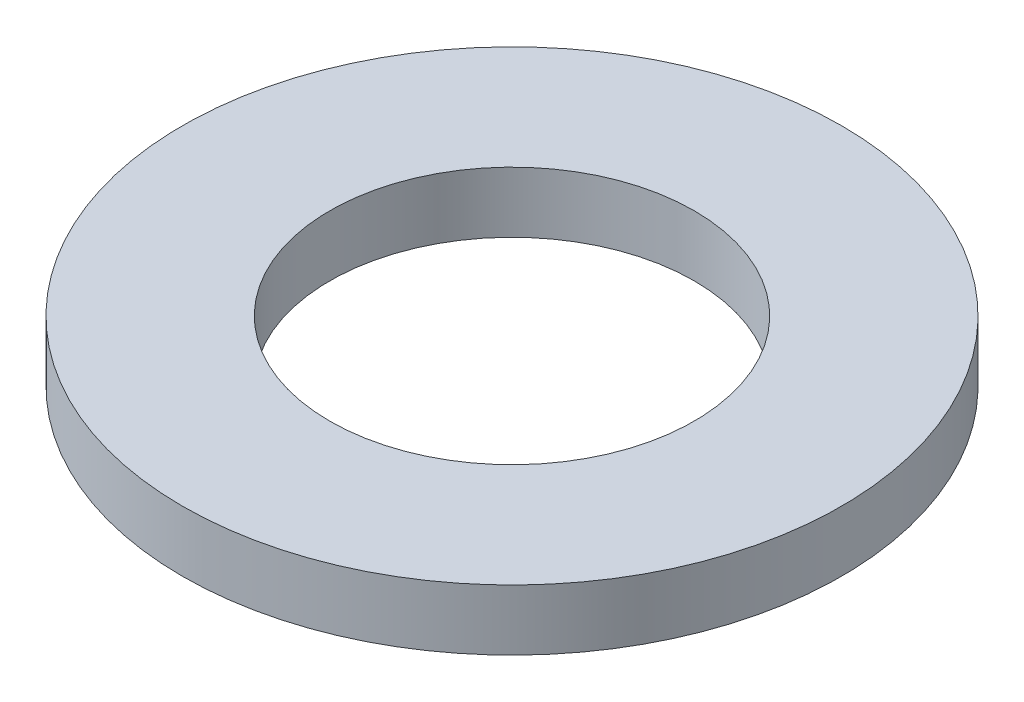
ISO-10303-21;
HEADER;
FILE_DESCRIPTION(('STEP AP214'),'2;1');
FILE_NAME('part.step','',(''),(''),'','','');
FILE_SCHEMA(('AUTOMOTIVE_DESIGN { 1 0 10303 214 1 1 1 1 }'));
ENDSEC;
DATA;
#1=APPLICATION_CONTEXT('core data for automotive mechanical design processes');
#2=APPLICATION_PROTOCOL_DEFINITION('international standard','automotive_design',2000,#1);
#3=PRODUCT_CONTEXT('',#1,'mechanical');
#4=PRODUCT('Part','Part','',(#3));
#5=PRODUCT_RELATED_PRODUCT_CATEGORY('part','',(#4));
#6=PRODUCT_DEFINITION_FORMATION('','',#4);
#7=PRODUCT_DEFINITION_CONTEXT('part definition',#1,'design');
#8=PRODUCT_DEFINITION('design','',#6,#7);
#9=PRODUCT_DEFINITION_SHAPE('','',#8);
#10=(LENGTH_UNIT() NAMED_UNIT(*) SI_UNIT(.MILLI.,.METRE.));
#11=(NAMED_UNIT(*) PLANE_ANGLE_UNIT() SI_UNIT($,.RADIAN.));
#12=(NAMED_UNIT(*) SI_UNIT($,.STERADIAN.) SOLID_ANGLE_UNIT());
#13=UNCERTAINTY_MEASURE_WITH_UNIT(LENGTH_MEASURE(1.E-05),#10,'distance_accuracy_value','');
#14=(GEOMETRIC_REPRESENTATION_CONTEXT(3) GLOBAL_UNCERTAINTY_ASSIGNED_CONTEXT((#13)) GLOBAL_UNIT_ASSIGNED_CONTEXT((#10,
#11,#12)) REPRESENTATION_CONTEXT('',''));
#15=CARTESIAN_POINT('',(0.,0.,0.));
#16=DIRECTION('',(0.,0.,1.));
#17=DIRECTION('',(1.,0.,0.));
#18=AXIS2_PLACEMENT_3D('',#15,#16,#17);
#19=CARTESIAN_POINT('',(-13.4902949203716,0.508,-17.5468171691547));
#20=DIRECTION('',(0.,1.,0.));
#21=DIRECTION('',(0.,0.,1.));
#22=AXIS2_PLACEMENT_3D('',#19,#20,#21);
#23=PLANE('',#22);
#24=CARTESIAN_POINT('',(-13.4902949203716,0.508,-17.5468171691547));
#25=DIRECTION('',(0.,1.,0.));
#26=DIRECTION('',(0.,0.,1.));
#27=AXIS2_PLACEMENT_3D('',#24,#25,#26);
#28=CIRCLE('',#27,2.7559);
#29=CARTESIAN_POINT('',(-13.4902949203716,0.508,-14.7909171691547));
#30=VERTEX_POINT('',#29);
#31=EDGE_CURVE('E10',#30,#30,#28,.T.);
#32=ORIENTED_EDGE('',*,*,#31,.T.);
#33=EDGE_LOOP('',(#32));
#34=FACE_BOUND('',#33,.T.);
#35=CARTESIAN_POINT('',(-13.4902949203716,0.508,-17.5468171691547));
#36=DIRECTION('',(0.,1.,0.));
#37=DIRECTION('',(0.,0.,1.));
#38=AXIS2_PLACEMENT_3D('',#35,#36,#37);
#39=CIRCLE('',#38,1.524);
#40=CARTESIAN_POINT('',(-13.4902949203716,0.508,-16.0228171691547));
#41=VERTEX_POINT('',#40);
#42=EDGE_CURVE('E46',#41,#41,#39,.T.);
#43=ORIENTED_EDGE('',*,*,#42,.F.);
#44=EDGE_LOOP('',(#43));
#45=FACE_BOUND('',#44,.T.);
#46=ADVANCED_FACE('F35',(#34,#45),#23,.T.);
#47=CARTESIAN_POINT('',(-13.4902949203716,0.,-17.5468171691547));
#48=DIRECTION('',(0.,1.,0.));
#49=DIRECTION('',(0.,0.,1.));
#50=AXIS2_PLACEMENT_3D('',#47,#48,#49);
#51=PLANE('',#50);
#52=CARTESIAN_POINT('',(-13.4902949203716,0.,-17.5468171691547));
#53=DIRECTION('',(0.,1.,0.));
#54=DIRECTION('',(0.,0.,1.));
#55=AXIS2_PLACEMENT_3D('',#52,#53,#54);
#56=CIRCLE('',#55,2.7559);
#57=CARTESIAN_POINT('',(-13.4902949203716,0.,-14.7909171691547));
#58=VERTEX_POINT('',#57);
#59=EDGE_CURVE('E39',#58,#58,#56,.T.);
#60=ORIENTED_EDGE('',*,*,#59,.F.);
#61=EDGE_LOOP('',(#60));
#62=FACE_BOUND('',#61,.T.);
#63=CARTESIAN_POINT('',(-13.4902949203716,0.,-17.5468171691547));
#64=DIRECTION('',(0.,1.,0.));
#65=DIRECTION('',(0.,0.,1.));
#66=AXIS2_PLACEMENT_3D('',#63,#64,#65);
#67=CIRCLE('',#66,1.524);
#68=CARTESIAN_POINT('',(-13.4902949203716,0.,-16.0228171691547));
#69=VERTEX_POINT('',#68);
#70=EDGE_CURVE('E48',#69,#69,#67,.T.);
#71=ORIENTED_EDGE('',*,*,#70,.T.);
#72=EDGE_LOOP('',(#71));
#73=FACE_BOUND('',#72,.T.);
#74=ADVANCED_FACE('F58',(#62,#73),#51,.F.);
#75=CARTESIAN_POINT('',(-13.4902949203716,0.508,-17.5468171691547));
#76=DIRECTION('',(0.,-1.,0.));
#77=DIRECTION('',(0.,0.,-1.));
#78=AXIS2_PLACEMENT_3D('',#75,#76,#77);
#79=CYLINDRICAL_SURFACE('',#78,2.7559);
#80=ORIENTED_EDGE('',*,*,#31,.F.);
#81=EDGE_LOOP('',(#80));
#82=FACE_BOUND('',#81,.T.);
#83=ORIENTED_EDGE('',*,*,#59,.T.);
#84=EDGE_LOOP('',(#83));
#85=FACE_BOUND('',#84,.T.);
#86=ADVANCED_FACE('F37',(#82,#85),#79,.T.);
#87=CARTESIAN_POINT('',(-13.4902949203716,0.508,-17.5468171691547));
#88=DIRECTION('',(0.,-1.,0.));
#89=DIRECTION('',(0.,0.,-1.));
#90=AXIS2_PLACEMENT_3D('',#87,#88,#89);
#91=CYLINDRICAL_SURFACE('',#90,1.524);
#92=ORIENTED_EDGE('',*,*,#42,.T.);
#93=EDGE_LOOP('',(#92));
#94=FACE_BOUND('',#93,.T.);
#95=ORIENTED_EDGE('',*,*,#70,.F.);
#96=EDGE_LOOP('',(#95));
#97=FACE_BOUND('',#96,.T.);
#98=ADVANCED_FACE('F54',(#94,#97),#91,.F.);
#99=CLOSED_SHELL('',(#46,#74,#86,#98));
#100=MANIFOLD_SOLID_BREP('B2',#99);
#101=ADVANCED_BREP_SHAPE_REPRESENTATION('',(#18,#100),#14);
#102=SHAPE_DEFINITION_REPRESENTATION(#9,#101);
ENDSEC;
END-ISO-10303-21;
